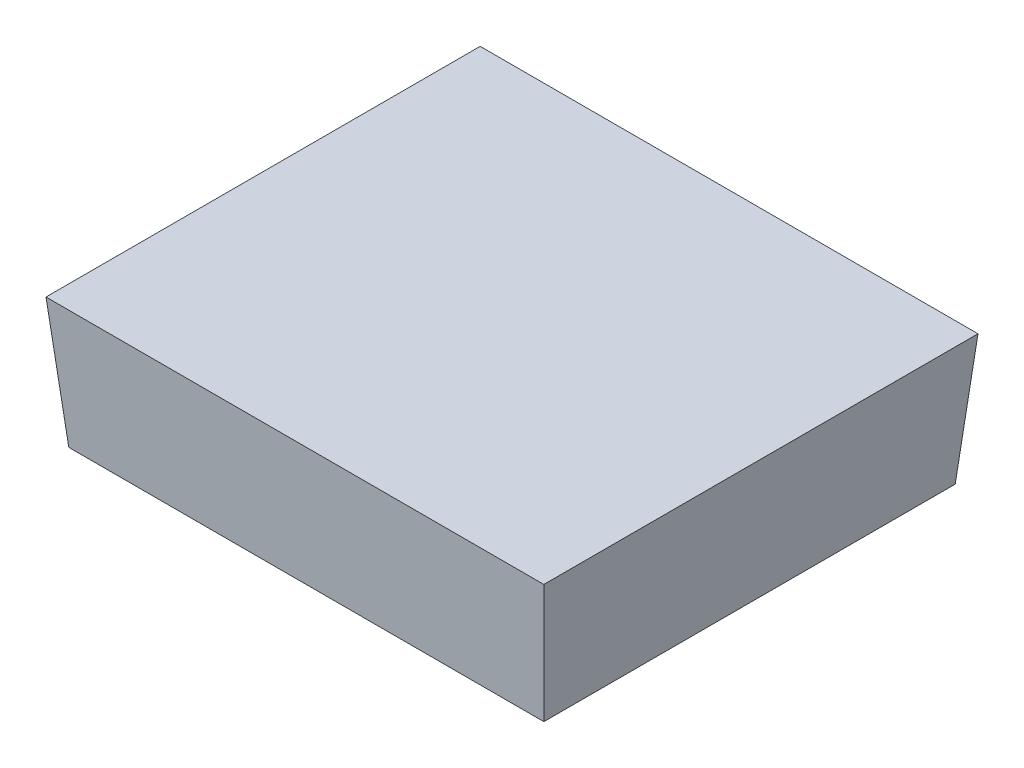
ISO-10303-21;
HEADER;
FILE_DESCRIPTION(('STEP AP214'),'2;1');
FILE_NAME('part.step','',(''),(''),'','','');
FILE_SCHEMA(('AUTOMOTIVE_DESIGN { 1 0 10303 214 1 1 1 1 }'));
ENDSEC;
DATA;
#1=APPLICATION_CONTEXT('core data for automotive mechanical design processes');
#2=APPLICATION_PROTOCOL_DEFINITION('international standard','automotive_design',2000,#1);
#3=PRODUCT_CONTEXT('',#1,'mechanical');
#4=PRODUCT('Part','Part','',(#3));
#5=PRODUCT_RELATED_PRODUCT_CATEGORY('part','',(#4));
#6=PRODUCT_DEFINITION_FORMATION('','',#4);
#7=PRODUCT_DEFINITION_CONTEXT('part definition',#1,'design');
#8=PRODUCT_DEFINITION('design','',#6,#7);
#9=PRODUCT_DEFINITION_SHAPE('','',#8);
#10=(LENGTH_UNIT() NAMED_UNIT(*) SI_UNIT(.MILLI.,.METRE.));
#11=(NAMED_UNIT(*) PLANE_ANGLE_UNIT() SI_UNIT($,.RADIAN.));
#12=(NAMED_UNIT(*) SI_UNIT($,.STERADIAN.) SOLID_ANGLE_UNIT());
#13=UNCERTAINTY_MEASURE_WITH_UNIT(LENGTH_MEASURE(1.E-05),#10,'distance_accuracy_value','');
#14=(GEOMETRIC_REPRESENTATION_CONTEXT(3) GLOBAL_UNCERTAINTY_ASSIGNED_CONTEXT((#13)) GLOBAL_UNIT_ASSIGNED_CONTEXT((#10,
#11,#12)) REPRESENTATION_CONTEXT('',''));
#15=CARTESIAN_POINT('',(0.,0.,0.));
#16=DIRECTION('',(0.,0.,1.));
#17=DIRECTION('',(1.,0.,0.));
#18=AXIS2_PLACEMENT_3D('',#15,#16,#17);
#19=CARTESIAN_POINT('',(0.,-0.1,0.));
#20=DIRECTION('',(0.,-1.,0.));
#21=DIRECTION('',(0.,0.,-1.));
#22=AXIS2_PLACEMENT_3D('',#19,#20,#21);
#23=PLANE('',#22);
#24=DIRECTION('',(0.,0.,-1.));
#25=VECTOR('',#24,1.);
#26=CARTESIAN_POINT('',(0.95,-0.1,-0.73));
#27=LINE('',#26,#25);
#28=CARTESIAN_POINT('',(0.95,-0.1,-0.73));
#29=VERTEX_POINT('',#28);
#30=CARTESIAN_POINT('',(0.95,-0.1,-2.27));
#31=VERTEX_POINT('',#30);
#32=EDGE_CURVE('E103',#29,#31,#27,.T.);
#33=ORIENTED_EDGE('',*,*,#32,.T.);
#34=DIRECTION('',(1.,0.,0.));
#35=VECTOR('',#34,1.);
#36=CARTESIAN_POINT('',(0.95,-0.1,-2.27));
#37=LINE('',#36,#35);
#38=CARTESIAN_POINT('',(2.49,-0.1,-2.27));
#39=VERTEX_POINT('',#38);
#40=EDGE_CURVE('E95',#31,#39,#37,.T.);
#41=ORIENTED_EDGE('',*,*,#40,.T.);
#42=DIRECTION('',(0.,0.,1.));
#43=VECTOR('',#42,1.);
#44=CARTESIAN_POINT('',(2.49,-0.1,-0.73));
#45=LINE('',#44,#43);
#46=CARTESIAN_POINT('',(2.49,-0.1,-0.73));
#47=VERTEX_POINT('',#46);
#48=EDGE_CURVE('E79',#39,#47,#45,.T.);
#49=ORIENTED_EDGE('',*,*,#48,.T.);
#50=DIRECTION('',(-1.,0.,0.));
#51=VECTOR('',#50,1.);
#52=CARTESIAN_POINT('',(0.95,-0.1,-0.73));
#53=LINE('',#52,#51);
#54=EDGE_CURVE('E20',#47,#29,#53,.T.);
#55=ORIENTED_EDGE('',*,*,#54,.T.);
#56=EDGE_LOOP('',(#33,#41,#49,#55));
#57=FACE_BOUND('',#56,.T.);
#58=ADVANCED_FACE('F17',(#57),#23,.T.);
#59=CARTESIAN_POINT('',(0.95,-0.1,-0.73));
#60=DIRECTION('',(0.,0.,-1.));
#61=DIRECTION('',(-1.,0.,0.));
#62=AXIS2_PLACEMENT_3D('',#59,#60,#61);
#63=PLANE('',#62);
#64=DIRECTION('',(0.,1.,0.));
#65=VECTOR('',#64,1.);
#66=CARTESIAN_POINT('',(0.95,-0.1,-0.73));
#67=LINE('',#66,#65);
#68=CARTESIAN_POINT('',(0.95,0.,-0.73));
#69=VERTEX_POINT('',#68);
#70=EDGE_CURVE('E89',#69,#29,#67,.F.);
#71=ORIENTED_EDGE('',*,*,#70,.T.);
#72=ORIENTED_EDGE('',*,*,#54,.F.);
#73=DIRECTION('',(0.,1.,0.));
#74=VECTOR('',#73,1.);
#75=CARTESIAN_POINT('',(2.49,-0.1,-0.73));
#76=LINE('',#75,#74);
#77=CARTESIAN_POINT('',(2.49,0.,-0.73));
#78=VERTEX_POINT('',#77);
#79=EDGE_CURVE('E87',#47,#78,#76,.T.);
#80=ORIENTED_EDGE('',*,*,#79,.T.);
#81=DIRECTION('',(1.,0.,0.));
#82=VECTOR('',#81,1.);
#83=CARTESIAN_POINT('',(0.,0.,-0.73));
#84=LINE('',#83,#82);
#85=EDGE_CURVE('E108',#69,#78,#84,.T.);
#86=ORIENTED_EDGE('',*,*,#85,.F.);
#87=EDGE_LOOP('',(#71,#72,#80,#86));
#88=FACE_BOUND('',#87,.T.);
#89=ADVANCED_FACE('F85',(#88),#63,.F.);
#90=CARTESIAN_POINT('',(2.49,-0.1,-0.73));
#91=DIRECTION('',(-1.,0.,0.));
#92=DIRECTION('',(0.,0.,1.));
#93=AXIS2_PLACEMENT_3D('',#90,#91,#92);
#94=PLANE('',#93);
#95=ORIENTED_EDGE('',*,*,#79,.F.);
#96=ORIENTED_EDGE('',*,*,#48,.F.);
#97=DIRECTION('',(0.,1.,0.));
#98=VECTOR('',#97,1.);
#99=CARTESIAN_POINT('',(2.49,-0.1,-2.27));
#100=LINE('',#99,#98);
#101=CARTESIAN_POINT('',(2.49,0.,-2.27));
#102=VERTEX_POINT('',#101);
#103=EDGE_CURVE('E100',#39,#102,#100,.T.);
#104=ORIENTED_EDGE('',*,*,#103,.T.);
#105=DIRECTION('',(0.,0.,-1.));
#106=VECTOR('',#105,1.);
#107=CARTESIAN_POINT('',(2.49,0.,0.));
#108=LINE('',#107,#106);
#109=EDGE_CURVE('E94',#78,#102,#108,.T.);
#110=ORIENTED_EDGE('',*,*,#109,.F.);
#111=EDGE_LOOP('',(#95,#96,#104,#110));
#112=FACE_BOUND('',#111,.T.);
#113=ADVANCED_FACE('F93',(#112),#94,.F.);
#114=CARTESIAN_POINT('',(0.95,-0.1,-2.27));
#115=DIRECTION('',(0.,0.,1.));
#116=DIRECTION('',(1.,0.,0.));
#117=AXIS2_PLACEMENT_3D('',#114,#115,#116);
#118=PLANE('',#117);
#119=ORIENTED_EDGE('',*,*,#103,.F.);
#120=ORIENTED_EDGE('',*,*,#40,.F.);
#121=DIRECTION('',(0.,1.,0.));
#122=VECTOR('',#121,1.);
#123=CARTESIAN_POINT('',(0.95,-0.1,-2.27));
#124=LINE('',#123,#122);
#125=CARTESIAN_POINT('',(0.95,0.,-2.27));
#126=VERTEX_POINT('',#125);
#127=EDGE_CURVE('E105',#31,#126,#124,.T.);
#128=ORIENTED_EDGE('',*,*,#127,.T.);
#129=DIRECTION('',(1.,0.,0.));
#130=VECTOR('',#129,1.);
#131=CARTESIAN_POINT('',(0.,0.,-2.27));
#132=LINE('',#131,#130);
#133=EDGE_CURVE('E111',#102,#126,#132,.F.);
#134=ORIENTED_EDGE('',*,*,#133,.F.);
#135=EDGE_LOOP('',(#119,#120,#128,#134));
#136=FACE_BOUND('',#135,.T.);
#137=ADVANCED_FACE('F177',(#136),#118,.F.);
#138=CARTESIAN_POINT('',(0.95,-0.1,-0.73));
#139=DIRECTION('',(1.,0.,0.));
#140=DIRECTION('',(0.,0.,-1.));
#141=AXIS2_PLACEMENT_3D('',#138,#139,#140);
#142=PLANE('',#141);
#143=ORIENTED_EDGE('',*,*,#127,.F.);
#144=ORIENTED_EDGE('',*,*,#32,.F.);
#145=ORIENTED_EDGE('',*,*,#70,.F.);
#146=DIRECTION('',(0.,0.,-1.));
#147=VECTOR('',#146,1.);
#148=CARTESIAN_POINT('',(0.95,0.,0.));
#149=LINE('',#148,#147);
#150=EDGE_CURVE('E113',#126,#69,#149,.F.);
#151=ORIENTED_EDGE('',*,*,#150,.F.);
#152=EDGE_LOOP('',(#143,#144,#145,#151));
#153=FACE_BOUND('',#152,.T.);
#154=ADVANCED_FACE('F173',(#153),#142,.F.);
#155=CARTESIAN_POINT('',(0.,0.,0.));
#156=DIRECTION('',(0.,-1.,0.));
#157=DIRECTION('',(0.,0.,-1.));
#158=AXIS2_PLACEMENT_3D('',#155,#156,#157);
#159=PLANE('',#158);
#160=ORIENTED_EDGE('',*,*,#133,.T.);
#161=ORIENTED_EDGE('',*,*,#150,.T.);
#162=ORIENTED_EDGE('',*,*,#85,.T.);
#163=ORIENTED_EDGE('',*,*,#109,.T.);
#164=EDGE_LOOP('',(#160,#161,#162,#163));
#165=FACE_BOUND('',#164,.T.);
#166=DIRECTION('',(0.,0.,1.));
#167=VECTOR('',#166,1.);
#168=CARTESIAN_POINT('',(3.36126020282671,0.,0.));
#169=LINE('',#168,#167);
#170=CARTESIAN_POINT('',(3.36126020282693,0.,-0.0787397971733213));
#171=VERTEX_POINT('',#170);
#172=CARTESIAN_POINT('',(3.36126020282693,0.,-2.92126020282693));
#173=VERTEX_POINT('',#172);
#174=EDGE_CURVE('E118',#171,#173,#169,.F.);
#175=ORIENTED_EDGE('',*,*,#174,.F.);
#176=DIRECTION('',(1.,0.,0.));
#177=VECTOR('',#176,1.);
#178=CARTESIAN_POINT('',(0.,0.,-0.0787397971732954));
#179=LINE('',#178,#177);
#180=CARTESIAN_POINT('',(0.0787397971733214,0.,-0.0787397971733213));
#181=VERTEX_POINT('',#180);
#182=EDGE_CURVE('E122',#181,#171,#179,.T.);
#183=ORIENTED_EDGE('',*,*,#182,.F.);
#184=DIRECTION('',(0.,0.,1.));
#185=VECTOR('',#184,1.);
#186=CARTESIAN_POINT('',(0.0787397971732954,0.,0.));
#187=LINE('',#186,#185);
#188=CARTESIAN_POINT('',(0.0787397971733213,0.,-2.92126020282693));
#189=VERTEX_POINT('',#188);
#190=EDGE_CURVE('E126',#189,#181,#187,.T.);
#191=ORIENTED_EDGE('',*,*,#190,.F.);
#192=DIRECTION('',(1.,0.,0.));
#193=VECTOR('',#192,1.);
#194=CARTESIAN_POINT('',(0.,0.,-2.92126020282671));
#195=LINE('',#194,#193);
#196=EDGE_CURVE('E116',#173,#189,#195,.F.);
#197=ORIENTED_EDGE('',*,*,#196,.F.);
#198=EDGE_LOOP('',(#175,#183,#191,#197));
#199=FACE_BOUND('',#198,.T.);
#200=ADVANCED_FACE('F170',(#165,#199),#159,.T.);
#201=CARTESIAN_POINT('',(0.,0.9,-3.));
#202=DIRECTION('',(0.,-0.0871557427476181,-0.996194698091749));
#203=DIRECTION('',(0.,0.996194698091749,-0.0871557427476181));
#204=AXIS2_PLACEMENT_3D('',#201,#202,#203);
#205=PLANE('',#204);
#206=DIRECTION('',(1.,0.,0.));
#207=VECTOR('',#206,1.);
#208=CARTESIAN_POINT('',(0.,0.9,-3.));
#209=LINE('',#208,#207);
#210=CARTESIAN_POINT('',(0.,0.9,-3.));
#211=VERTEX_POINT('',#210);
#212=CARTESIAN_POINT('',(3.44,0.9,-3.));
#213=VERTEX_POINT('',#212);
#214=EDGE_CURVE('E132',#211,#213,#209,.T.);
#215=ORIENTED_EDGE('',*,*,#214,.T.);
#216=DIRECTION('',(0.0868265938642101,0.992432509139002,-0.0868265938638887));
#217=VECTOR('',#216,1.);
#218=CARTESIAN_POINT('',(3.36126020282671,0.,-2.921260202827));
#219=LINE('',#218,#217);
#220=EDGE_CURVE('E120',#173,#213,#219,.T.);
#221=ORIENTED_EDGE('',*,*,#220,.F.);
#222=ORIENTED_EDGE('',*,*,#196,.T.);
#223=DIRECTION('',(0.0868265938642104,-0.992432509139002,0.086826593863886));
#224=VECTOR('',#223,1.);
#225=CARTESIAN_POINT('',(0.,0.9,-3.));
#226=LINE('',#225,#224);
#227=EDGE_CURVE('E129',#211,#189,#226,.T.);
#228=ORIENTED_EDGE('',*,*,#227,.F.);
#229=EDGE_LOOP('',(#215,#221,#222,#228));
#230=FACE_BOUND('',#229,.T.);
#231=ADVANCED_FACE('F152',(#230),#205,.T.);
#232=CARTESIAN_POINT('',(3.44,0.9,0.));
#233=DIRECTION('',(0.996194698091749,-0.0871557427476181,0.));
#234=DIRECTION('',(0.0871557427476181,0.996194698091749,0.));
#235=AXIS2_PLACEMENT_3D('',#232,#233,#234);
#236=PLANE('',#235);
#237=DIRECTION('',(0.,0.,-1.));
#238=VECTOR('',#237,1.);
#239=CARTESIAN_POINT('',(3.44,0.9,0.));
#240=LINE('',#239,#238);
#241=CARTESIAN_POINT('',(3.44,0.9,0.));
#242=VERTEX_POINT('',#241);
#243=EDGE_CURVE('E135',#213,#242,#240,.F.);
#244=ORIENTED_EDGE('',*,*,#243,.T.);
#245=DIRECTION('',(0.0868265938638841,0.992432509139002,0.0868265938642104));
#246=VECTOR('',#245,1.);
#247=CARTESIAN_POINT('',(3.361260202827,0.,-0.0787397971732954));
#248=LINE('',#247,#246);
#249=EDGE_CURVE('E124',#171,#242,#248,.T.);
#250=ORIENTED_EDGE('',*,*,#249,.F.);
#251=ORIENTED_EDGE('',*,*,#174,.T.);
#252=ORIENTED_EDGE('',*,*,#220,.T.);
#253=EDGE_LOOP('',(#244,#250,#251,#252));
#254=FACE_BOUND('',#253,.T.);
#255=ADVANCED_FACE('F147',(#254),#236,.T.);
#256=CARTESIAN_POINT('',(0.,0.9,0.));
#257=DIRECTION('',(0.,-0.0871557427476181,0.996194698091749));
#258=DIRECTION('',(0.,-0.996194698091749,-0.0871557427476181));
#259=AXIS2_PLACEMENT_3D('',#256,#257,#258);
#260=PLANE('',#259);
#261=DIRECTION('',(1.,0.,0.));
#262=VECTOR('',#261,1.);
#263=CARTESIAN_POINT('',(0.,0.9,0.));
#264=LINE('',#263,#262);
#265=CARTESIAN_POINT('',(0.,0.9,0.));
#266=VERTEX_POINT('',#265);
#267=EDGE_CURVE('E26',#242,#266,#264,.F.);
#268=ORIENTED_EDGE('',*,*,#267,.T.);
#269=DIRECTION('',(-0.0868265938642077,0.992432509138971,0.0868265938642459));
#270=VECTOR('',#269,1.);
#271=CARTESIAN_POINT('',(0.0787397971732954,0.,-0.07873979717333));
#272=LINE('',#271,#270);
#273=EDGE_CURVE('E34',#181,#266,#272,.T.);
#274=ORIENTED_EDGE('',*,*,#273,.F.);
#275=ORIENTED_EDGE('',*,*,#182,.T.);
#276=ORIENTED_EDGE('',*,*,#249,.T.);
#277=EDGE_LOOP('',(#268,#274,#275,#276));
#278=FACE_BOUND('',#277,.T.);
#279=ADVANCED_FACE('F141',(#278),#260,.T.);
#280=CARTESIAN_POINT('',(0.,0.9,0.));
#281=DIRECTION('',(-0.996194698091749,-0.0871557427476181,0.));
#282=DIRECTION('',(0.0871557427476181,-0.996194698091749,0.));
#283=AXIS2_PLACEMENT_3D('',#280,#281,#282);
#284=PLANE('',#283);
#285=DIRECTION('',(0.,0.,-1.));
#286=VECTOR('',#285,1.);
#287=CARTESIAN_POINT('',(0.,0.9,0.));
#288=LINE('',#287,#286);
#289=EDGE_CURVE('E11',#266,#211,#288,.T.);
#290=ORIENTED_EDGE('',*,*,#289,.T.);
#291=ORIENTED_EDGE('',*,*,#227,.T.);
#292=ORIENTED_EDGE('',*,*,#190,.T.);
#293=ORIENTED_EDGE('',*,*,#273,.T.);
#294=EDGE_LOOP('',(#290,#291,#292,#293));
#295=FACE_BOUND('',#294,.T.);
#296=ADVANCED_FACE('F155',(#295),#284,.T.);
#297=CARTESIAN_POINT('',(0.,0.9,0.));
#298=DIRECTION('',(0.,-1.,0.));
#299=DIRECTION('',(0.,0.,-1.));
#300=AXIS2_PLACEMENT_3D('',#297,#298,#299);
#301=PLANE('',#300);
#302=ORIENTED_EDGE('',*,*,#267,.F.);
#303=ORIENTED_EDGE('',*,*,#243,.F.);
#304=ORIENTED_EDGE('',*,*,#214,.F.);
#305=ORIENTED_EDGE('',*,*,#289,.F.);
#306=EDGE_LOOP('',(#302,#303,#304,#305));
#307=FACE_BOUND('',#306,.T.);
#308=ADVANCED_FACE('F145',(#307),#301,.F.);
#309=CLOSED_SHELL('',(#58,#89,#113,#137,#154,#200,#231,#255,#279,#296,#308));
#310=MANIFOLD_SOLID_BREP('B1',#309);
#311=ADVANCED_BREP_SHAPE_REPRESENTATION('',(#18,#310),#14);
#312=SHAPE_DEFINITION_REPRESENTATION(#9,#311);
ENDSEC;
END-ISO-10303-21;
